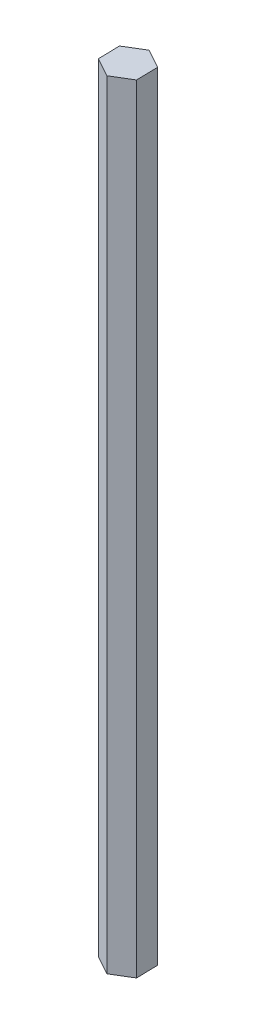
ISO-10303-21;
HEADER;
FILE_DESCRIPTION(('STEP AP214'),'2;1');
FILE_NAME('part.step','',(''),(''),'','','');
FILE_SCHEMA(('AUTOMOTIVE_DESIGN { 1 0 10303 214 1 1 1 1 }'));
ENDSEC;
DATA;
#1=APPLICATION_CONTEXT('core data for automotive mechanical design processes');
#2=APPLICATION_PROTOCOL_DEFINITION('international standard','automotive_design',2000,#1);
#3=PRODUCT_CONTEXT('',#1,'mechanical');
#4=PRODUCT('Part','Part','',(#3));
#5=PRODUCT_RELATED_PRODUCT_CATEGORY('part','',(#4));
#6=PRODUCT_DEFINITION_FORMATION('','',#4);
#7=PRODUCT_DEFINITION_CONTEXT('part definition',#1,'design');
#8=PRODUCT_DEFINITION('design','',#6,#7);
#9=PRODUCT_DEFINITION_SHAPE('','',#8);
#10=(LENGTH_UNIT() NAMED_UNIT(*) SI_UNIT(.MILLI.,.METRE.));
#11=(NAMED_UNIT(*) PLANE_ANGLE_UNIT() SI_UNIT($,.RADIAN.));
#12=(NAMED_UNIT(*) SI_UNIT($,.STERADIAN.) SOLID_ANGLE_UNIT());
#13=UNCERTAINTY_MEASURE_WITH_UNIT(LENGTH_MEASURE(1.E-05),#10,'distance_accuracy_value','');
#14=(GEOMETRIC_REPRESENTATION_CONTEXT(3) GLOBAL_UNCERTAINTY_ASSIGNED_CONTEXT((#13)) GLOBAL_UNIT_ASSIGNED_CONTEXT((#10,
#11,#12)) REPRESENTATION_CONTEXT('',''));
#15=CARTESIAN_POINT('',(0.,0.,0.));
#16=DIRECTION('',(0.,0.,1.));
#17=DIRECTION('',(1.,0.,0.));
#18=AXIS2_PLACEMENT_3D('',#15,#16,#17);
#19=CARTESIAN_POINT('',(0.0465450312670683,83.,2.30893198111111));
#20=DIRECTION('',(-0.51735282453829,0.,-0.855772198042361));
#21=DIRECTION('',(-0.855772198042361,0.,0.51735282453829));
#22=AXIS2_PLACEMENT_3D('',#19,#20,#21);
#23=PLANE('',#22);
#24=DIRECTION('',(0.855772198042361,0.,-0.51735282453829));
#25=VECTOR('',#24,1.);
#26=CARTESIAN_POINT('',(0.0465450312670683,0.,2.30893198111111));
#27=LINE('',#26,#25);
#28=CARTESIAN_POINT('',(0.0465450312670683,0.,2.30893198111111));
#29=VERTEX_POINT('',#28);
#30=CARTESIAN_POINT('',(2.02286626688609,0.,1.11415681105833));
#31=VERTEX_POINT('',#30);
#32=EDGE_CURVE('E132',#29,#31,#27,.T.);
#33=ORIENTED_EDGE('',*,*,#32,.T.);
#34=DIRECTION('',(0.,-1.,0.));
#35=VECTOR('',#34,1.);
#36=CARTESIAN_POINT('',(2.02286626688609,83.,1.11415681105833));
#37=LINE('',#36,#35);
#38=CARTESIAN_POINT('',(2.02286626688609,83.,1.11415681105833));
#39=VERTEX_POINT('',#38);
#40=EDGE_CURVE('E11',#39,#31,#37,.T.);
#41=ORIENTED_EDGE('',*,*,#40,.F.);
#42=DIRECTION('',(0.855772198042361,0.,-0.51735282453829));
#43=VECTOR('',#42,1.);
#44=CARTESIAN_POINT('',(0.0465450312670683,83.,2.30893198111111));
#45=LINE('',#44,#43);
#46=CARTESIAN_POINT('',(0.0465450312670683,83.,2.30893198111111));
#47=VERTEX_POINT('',#46);
#48=EDGE_CURVE('E148',#47,#39,#45,.T.);
#49=ORIENTED_EDGE('',*,*,#48,.F.);
#50=DIRECTION('',(0.,-1.,0.));
#51=VECTOR('',#50,1.);
#52=CARTESIAN_POINT('',(0.0465450312670683,83.,2.30893198111111));
#53=LINE('',#52,#51);
#54=EDGE_CURVE('E128',#47,#29,#53,.T.);
#55=ORIENTED_EDGE('',*,*,#54,.T.);
#56=EDGE_LOOP('',(#33,#41,#49,#55));
#57=FACE_BOUND('',#56,.T.);
#58=ADVANCED_FACE('F43',(#57),#23,.F.);
#59=CARTESIAN_POINT('',(2.02286626688609,83.,1.11415681105833));
#60=DIRECTION('',(-0.999796875626277,0.,0.0201545897486114));
#61=DIRECTION('',(0.0201545897486114,0.,0.999796875626277));
#62=AXIS2_PLACEMENT_3D('',#59,#60,#61);
#63=PLANE('',#62);
#64=DIRECTION('',(-0.0201545897486114,0.,-0.999796875626277));
#65=VECTOR('',#64,1.);
#66=CARTESIAN_POINT('',(2.02286626688609,0.,1.11415681105833));
#67=LINE('',#66,#65);
#68=CARTESIAN_POINT('',(1.97632123561902,0.,-1.19477517005278));
#69=VERTEX_POINT('',#68);
#70=EDGE_CURVE('E136',#31,#69,#67,.T.);
#71=ORIENTED_EDGE('',*,*,#70,.T.);
#72=DIRECTION('',(0.,-1.,0.));
#73=VECTOR('',#72,1.);
#74=CARTESIAN_POINT('',(1.97632123561902,83.,-1.19477517005278));
#75=LINE('',#74,#73);
#76=CARTESIAN_POINT('',(1.97632123561902,83.,-1.19477517005278));
#77=VERTEX_POINT('',#76);
#78=EDGE_CURVE('E52',#77,#69,#75,.T.);
#79=ORIENTED_EDGE('',*,*,#78,.F.);
#80=DIRECTION('',(-0.0201545897486114,0.,-0.999796875626277));
#81=VECTOR('',#80,1.);
#82=CARTESIAN_POINT('',(2.02286626688609,83.,1.11415681105833));
#83=LINE('',#82,#81);
#84=EDGE_CURVE('E97',#39,#77,#83,.T.);
#85=ORIENTED_EDGE('',*,*,#84,.F.);
#86=ORIENTED_EDGE('',*,*,#40,.T.);
#87=EDGE_LOOP('',(#71,#79,#85,#86));
#88=FACE_BOUND('',#87,.T.);
#89=ADVANCED_FACE('F176',(#88),#63,.F.);
#90=CARTESIAN_POINT('',(1.97632123561902,83.,-1.19477517005278));
#91=DIRECTION('',(-0.482444051087988,0.,0.875926787790972));
#92=DIRECTION('',(0.875926787790973,0.,0.482444051087988));
#93=AXIS2_PLACEMENT_3D('',#90,#91,#92);
#94=PLANE('',#93);
#95=DIRECTION('',(-0.875926787790972,0.,-0.482444051087988));
#96=VECTOR('',#95,1.);
#97=CARTESIAN_POINT('',(1.97632123561902,0.,-1.19477517005278));
#98=LINE('',#97,#96);
#99=CARTESIAN_POINT('',(-0.0465450312670686,0.,-2.30893198111111));
#100=VERTEX_POINT('',#99);
#101=EDGE_CURVE('E139',#69,#100,#98,.T.);
#102=ORIENTED_EDGE('',*,*,#101,.T.);
#103=DIRECTION('',(0.,-1.,0.));
#104=VECTOR('',#103,1.);
#105=CARTESIAN_POINT('',(-0.0465450312670686,83.,-2.30893198111111));
#106=LINE('',#105,#104);
#107=CARTESIAN_POINT('',(-0.0465450312670686,83.,-2.30893198111111));
#108=VERTEX_POINT('',#107);
#109=EDGE_CURVE('E121',#108,#100,#106,.T.);
#110=ORIENTED_EDGE('',*,*,#109,.F.);
#111=DIRECTION('',(-0.875926787790972,0.,-0.482444051087988));
#112=VECTOR('',#111,1.);
#113=CARTESIAN_POINT('',(1.97632123561902,83.,-1.19477517005278));
#114=LINE('',#113,#112);
#115=EDGE_CURVE('E110',#77,#108,#114,.T.);
#116=ORIENTED_EDGE('',*,*,#115,.F.);
#117=ORIENTED_EDGE('',*,*,#78,.T.);
#118=EDGE_LOOP('',(#102,#110,#116,#117));
#119=FACE_BOUND('',#118,.T.);
#120=ADVANCED_FACE('F158',(#119),#94,.F.);
#121=CARTESIAN_POINT('',(-0.0465450312670686,83.,-2.30893198111111));
#122=DIRECTION('',(0.51735282453829,0.,0.855772198042361));
#123=DIRECTION('',(0.855772198042361,0.,-0.51735282453829));
#124=AXIS2_PLACEMENT_3D('',#121,#122,#123);
#125=PLANE('',#124);
#126=DIRECTION('',(-0.855772198042361,0.,0.51735282453829));
#127=VECTOR('',#126,1.);
#128=CARTESIAN_POINT('',(-0.0465450312670686,0.,-2.30893198111111));
#129=LINE('',#128,#127);
#130=CARTESIAN_POINT('',(-2.02286626688609,0.,-1.11415681105833));
#131=VERTEX_POINT('',#130);
#132=EDGE_CURVE('E119',#100,#131,#129,.T.);
#133=ORIENTED_EDGE('',*,*,#132,.T.);
#134=DIRECTION('',(0.,-1.,0.));
#135=VECTOR('',#134,1.);
#136=CARTESIAN_POINT('',(-2.02286626688609,83.,-1.11415681105833));
#137=LINE('',#136,#135);
#138=CARTESIAN_POINT('',(-2.02286626688609,83.,-1.11415681105833));
#139=VERTEX_POINT('',#138);
#140=EDGE_CURVE('E116',#139,#131,#137,.T.);
#141=ORIENTED_EDGE('',*,*,#140,.F.);
#142=DIRECTION('',(-0.855772198042361,0.,0.51735282453829));
#143=VECTOR('',#142,1.);
#144=CARTESIAN_POINT('',(-0.0465450312670686,83.,-2.30893198111111));
#145=LINE('',#144,#143);
#146=EDGE_CURVE('E104',#108,#139,#145,.T.);
#147=ORIENTED_EDGE('',*,*,#146,.F.);
#148=ORIENTED_EDGE('',*,*,#109,.T.);
#149=EDGE_LOOP('',(#133,#141,#147,#148));
#150=FACE_BOUND('',#149,.T.);
#151=ADVANCED_FACE('F117',(#150),#125,.F.);
#152=CARTESIAN_POINT('',(-2.02286626688609,83.,-1.11415681105833));
#153=DIRECTION('',(0.999796875626277,0.,-0.0201545897486114));
#154=DIRECTION('',(-0.0201545897486114,0.,-0.999796875626277));
#155=AXIS2_PLACEMENT_3D('',#152,#153,#154);
#156=PLANE('',#155);
#157=DIRECTION('',(0.0201545897486114,0.,0.999796875626277));
#158=VECTOR('',#157,1.);
#159=CARTESIAN_POINT('',(-2.02286626688609,0.,-1.11415681105833));
#160=LINE('',#159,#158);
#161=CARTESIAN_POINT('',(-1.97632123561902,0.,1.19477517005278));
#162=VERTEX_POINT('',#161);
#163=EDGE_CURVE('E83',#131,#162,#160,.T.);
#164=ORIENTED_EDGE('',*,*,#163,.T.);
#165=DIRECTION('',(0.,-1.,0.));
#166=VECTOR('',#165,1.);
#167=CARTESIAN_POINT('',(-1.97632123561902,83.,1.19477517005278));
#168=LINE('',#167,#166);
#169=CARTESIAN_POINT('',(-1.97632123561902,83.,1.19477517005278));
#170=VERTEX_POINT('',#169);
#171=EDGE_CURVE('E122',#170,#162,#168,.T.);
#172=ORIENTED_EDGE('',*,*,#171,.F.);
#173=DIRECTION('',(0.0201545897486114,0.,0.999796875626277));
#174=VECTOR('',#173,1.);
#175=CARTESIAN_POINT('',(-2.02286626688609,83.,-1.11415681105833));
#176=LINE('',#175,#174);
#177=EDGE_CURVE('E108',#139,#170,#176,.T.);
#178=ORIENTED_EDGE('',*,*,#177,.F.);
#179=ORIENTED_EDGE('',*,*,#140,.T.);
#180=EDGE_LOOP('',(#164,#172,#178,#179));
#181=FACE_BOUND('',#180,.T.);
#182=ADVANCED_FACE('F124',(#181),#156,.F.);
#183=CARTESIAN_POINT('',(-1.97632123561902,83.,1.19477517005278));
#184=DIRECTION('',(0.482444051087988,0.,-0.875926787790972));
#185=DIRECTION('',(-0.875926787790973,0.,-0.482444051087988));
#186=AXIS2_PLACEMENT_3D('',#183,#184,#185);
#187=PLANE('',#186);
#188=DIRECTION('',(0.875926787790972,0.,0.482444051087988));
#189=VECTOR('',#188,1.);
#190=CARTESIAN_POINT('',(-1.97632123561902,0.,1.19477517005278));
#191=LINE('',#190,#189);
#192=EDGE_CURVE('E89',#162,#29,#191,.T.);
#193=ORIENTED_EDGE('',*,*,#192,.T.);
#194=ORIENTED_EDGE('',*,*,#54,.F.);
#195=DIRECTION('',(0.875926787790972,0.,0.482444051087988));
#196=VECTOR('',#195,1.);
#197=CARTESIAN_POINT('',(-1.97632123561902,83.,1.19477517005278));
#198=LINE('',#197,#196);
#199=EDGE_CURVE('E60',#170,#47,#198,.T.);
#200=ORIENTED_EDGE('',*,*,#199,.F.);
#201=ORIENTED_EDGE('',*,*,#171,.T.);
#202=EDGE_LOOP('',(#193,#194,#200,#201));
#203=FACE_BOUND('',#202,.T.);
#204=ADVANCED_FACE('F165',(#203),#187,.F.);
#205=CARTESIAN_POINT('',(0.,83.,0.));
#206=DIRECTION('',(0.,1.,0.));
#207=DIRECTION('',(0.,0.,1.));
#208=AXIS2_PLACEMENT_3D('',#205,#206,#207);
#209=PLANE('',#208);
#210=ORIENTED_EDGE('',*,*,#48,.T.);
#211=ORIENTED_EDGE('',*,*,#84,.T.);
#212=ORIENTED_EDGE('',*,*,#115,.T.);
#213=ORIENTED_EDGE('',*,*,#146,.T.);
#214=ORIENTED_EDGE('',*,*,#177,.T.);
#215=ORIENTED_EDGE('',*,*,#199,.T.);
#216=EDGE_LOOP('',(#210,#211,#212,#213,#214,#215));
#217=FACE_BOUND('',#216,.T.);
#218=ADVANCED_FACE('F106',(#217),#209,.T.);
#219=CARTESIAN_POINT('',(0.,0.,0.));
#220=DIRECTION('',(0.,1.,0.));
#221=DIRECTION('',(0.,0.,1.));
#222=AXIS2_PLACEMENT_3D('',#219,#220,#221);
#223=PLANE('',#222);
#224=ORIENTED_EDGE('',*,*,#32,.F.);
#225=ORIENTED_EDGE('',*,*,#192,.F.);
#226=ORIENTED_EDGE('',*,*,#163,.F.);
#227=ORIENTED_EDGE('',*,*,#132,.F.);
#228=ORIENTED_EDGE('',*,*,#101,.F.);
#229=ORIENTED_EDGE('',*,*,#70,.F.);
#230=EDGE_LOOP('',(#224,#225,#226,#227,#228,#229));
#231=FACE_BOUND('',#230,.T.);
#232=ADVANCED_FACE('F161',(#231),#223,.F.);
#233=CLOSED_SHELL('',(#58,#89,#120,#151,#182,#204,#218,#232));
#234=MANIFOLD_SOLID_BREP('B2',#233);
#235=ADVANCED_BREP_SHAPE_REPRESENTATION('',(#18,#234),#14);
#236=SHAPE_DEFINITION_REPRESENTATION(#9,#235);
ENDSEC;
END-ISO-10303-21;
